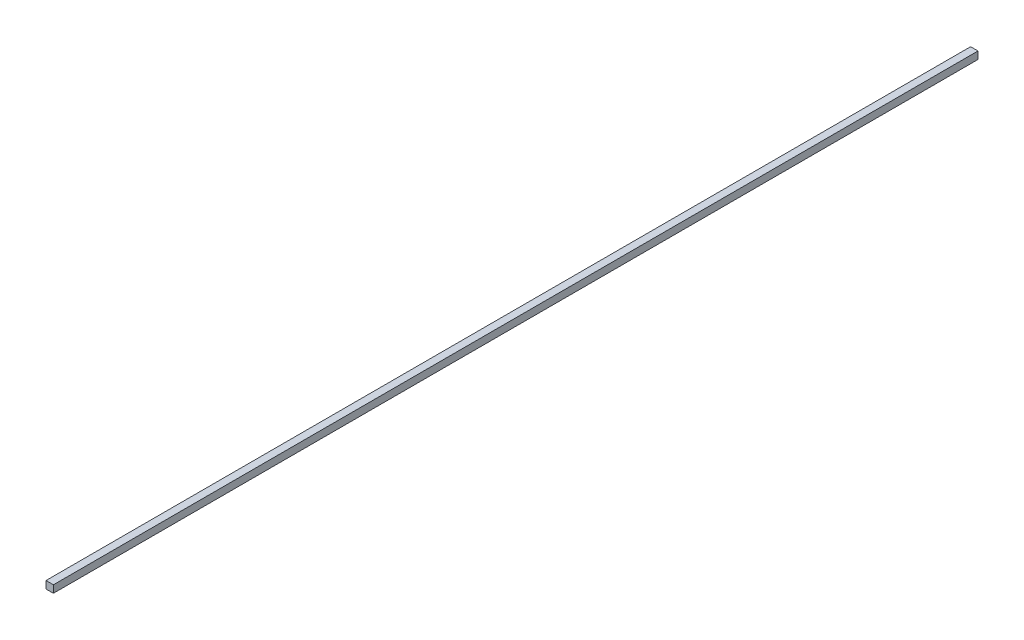
ISO-10303-21;
HEADER;
FILE_DESCRIPTION(('STEP AP214'),'2;1');
FILE_NAME('part.step','',(''),(''),'','','');
FILE_SCHEMA(('AUTOMOTIVE_DESIGN { 1 0 10303 214 1 1 1 1 }'));
ENDSEC;
DATA;
#1=APPLICATION_CONTEXT('core data for automotive mechanical design processes');
#2=APPLICATION_PROTOCOL_DEFINITION('international standard','automotive_design',2000,#1);
#3=PRODUCT_CONTEXT('',#1,'mechanical');
#4=PRODUCT('Part','Part','',(#3));
#5=PRODUCT_RELATED_PRODUCT_CATEGORY('part','',(#4));
#6=PRODUCT_DEFINITION_FORMATION('','',#4);
#7=PRODUCT_DEFINITION_CONTEXT('part definition',#1,'design');
#8=PRODUCT_DEFINITION('design','',#6,#7);
#9=PRODUCT_DEFINITION_SHAPE('','',#8);
#10=(LENGTH_UNIT() NAMED_UNIT(*) SI_UNIT(.MILLI.,.METRE.));
#11=(NAMED_UNIT(*) PLANE_ANGLE_UNIT() SI_UNIT($,.RADIAN.));
#12=(NAMED_UNIT(*) SI_UNIT($,.STERADIAN.) SOLID_ANGLE_UNIT());
#13=UNCERTAINTY_MEASURE_WITH_UNIT(LENGTH_MEASURE(1.E-05),#10,'distance_accuracy_value','');
#14=(GEOMETRIC_REPRESENTATION_CONTEXT(3) GLOBAL_UNCERTAINTY_ASSIGNED_CONTEXT((#13)) GLOBAL_UNIT_ASSIGNED_CONTEXT((#10,
#11,#12)) REPRESENTATION_CONTEXT('',''));
#15=CARTESIAN_POINT('',(0.,0.,0.));
#16=DIRECTION('',(0.,0.,1.));
#17=DIRECTION('',(1.,0.,0.));
#18=AXIS2_PLACEMENT_3D('',#15,#16,#17);
#19=CARTESIAN_POINT('',(0.,0.,2500.));
#20=DIRECTION('',(1.,0.,0.));
#21=DIRECTION('',(0.,0.,-1.));
#22=AXIS2_PLACEMENT_3D('',#19,#20,#21);
#23=PLANE('',#22);
#24=DIRECTION('',(0.,-1.,0.));
#25=VECTOR('',#24,1.);
#26=CARTESIAN_POINT('',(0.,0.,0.));
#27=LINE('',#26,#25);
#28=CARTESIAN_POINT('',(0.,20.,0.));
#29=VERTEX_POINT('',#28);
#30=CARTESIAN_POINT('',(0.,0.,0.));
#31=VERTEX_POINT('',#30);
#32=EDGE_CURVE('E96',#29,#31,#27,.T.);
#33=ORIENTED_EDGE('',*,*,#32,.T.);
#34=DIRECTION('',(0.,0.,-1.));
#35=VECTOR('',#34,1.);
#36=CARTESIAN_POINT('',(0.,0.,2500.));
#37=LINE('',#36,#35);
#38=CARTESIAN_POINT('',(0.,0.,2500.));
#39=VERTEX_POINT('',#38);
#40=EDGE_CURVE('E11',#39,#31,#37,.T.);
#41=ORIENTED_EDGE('',*,*,#40,.F.);
#42=DIRECTION('',(0.,-1.,0.));
#43=VECTOR('',#42,1.);
#44=CARTESIAN_POINT('',(0.,0.,2500.));
#45=LINE('',#44,#43);
#46=CARTESIAN_POINT('',(0.,20.,2500.));
#47=VERTEX_POINT('',#46);
#48=EDGE_CURVE('E84',#47,#39,#45,.T.);
#49=ORIENTED_EDGE('',*,*,#48,.F.);
#50=DIRECTION('',(0.,0.,-1.));
#51=VECTOR('',#50,1.);
#52=CARTESIAN_POINT('',(0.,20.,2500.));
#53=LINE('',#52,#51);
#54=EDGE_CURVE('E92',#47,#29,#53,.T.);
#55=ORIENTED_EDGE('',*,*,#54,.T.);
#56=EDGE_LOOP('',(#33,#41,#49,#55));
#57=FACE_BOUND('',#56,.T.);
#58=ADVANCED_FACE('F33',(#57),#23,.F.);
#59=CARTESIAN_POINT('',(0.,0.,2500.));
#60=DIRECTION('',(0.,1.,0.));
#61=DIRECTION('',(0.,0.,1.));
#62=AXIS2_PLACEMENT_3D('',#59,#60,#61);
#63=PLANE('',#62);
#64=DIRECTION('',(1.,0.,0.));
#65=VECTOR('',#64,1.);
#66=CARTESIAN_POINT('',(0.,0.,0.));
#67=LINE('',#66,#65);
#68=CARTESIAN_POINT('',(20.,0.,0.));
#69=VERTEX_POINT('',#68);
#70=EDGE_CURVE('E88',#31,#69,#67,.T.);
#71=ORIENTED_EDGE('',*,*,#70,.T.);
#72=DIRECTION('',(0.,0.,-1.));
#73=VECTOR('',#72,1.);
#74=CARTESIAN_POINT('',(20.,0.,2500.));
#75=LINE('',#74,#73);
#76=CARTESIAN_POINT('',(20.,0.,2500.));
#77=VERTEX_POINT('',#76);
#78=EDGE_CURVE('E41',#77,#69,#75,.T.);
#79=ORIENTED_EDGE('',*,*,#78,.F.);
#80=DIRECTION('',(1.,0.,0.));
#81=VECTOR('',#80,1.);
#82=CARTESIAN_POINT('',(0.,0.,2500.));
#83=LINE('',#82,#81);
#84=EDGE_CURVE('E79',#39,#77,#83,.T.);
#85=ORIENTED_EDGE('',*,*,#84,.F.);
#86=ORIENTED_EDGE('',*,*,#40,.T.);
#87=EDGE_LOOP('',(#71,#79,#85,#86));
#88=FACE_BOUND('',#87,.T.);
#89=ADVANCED_FACE('F87',(#88),#63,.F.);
#90=CARTESIAN_POINT('',(20.,0.,2500.));
#91=DIRECTION('',(-1.,0.,0.));
#92=DIRECTION('',(0.,0.,1.));
#93=AXIS2_PLACEMENT_3D('',#90,#91,#92);
#94=PLANE('',#93);
#95=DIRECTION('',(0.,1.,0.));
#96=VECTOR('',#95,1.);
#97=CARTESIAN_POINT('',(20.,0.,0.));
#98=LINE('',#97,#96);
#99=CARTESIAN_POINT('',(20.,20.,0.));
#100=VERTEX_POINT('',#99);
#101=EDGE_CURVE('E66',#69,#100,#98,.T.);
#102=ORIENTED_EDGE('',*,*,#101,.T.);
#103=DIRECTION('',(0.,0.,-1.));
#104=VECTOR('',#103,1.);
#105=CARTESIAN_POINT('',(20.,20.,2500.));
#106=LINE('',#105,#104);
#107=CARTESIAN_POINT('',(20.,20.,2500.));
#108=VERTEX_POINT('',#107);
#109=EDGE_CURVE('E89',#108,#100,#106,.T.);
#110=ORIENTED_EDGE('',*,*,#109,.F.);
#111=DIRECTION('',(0.,1.,0.));
#112=VECTOR('',#111,1.);
#113=CARTESIAN_POINT('',(20.,0.,2500.));
#114=LINE('',#113,#112);
#115=EDGE_CURVE('E82',#77,#108,#114,.T.);
#116=ORIENTED_EDGE('',*,*,#115,.F.);
#117=ORIENTED_EDGE('',*,*,#78,.T.);
#118=EDGE_LOOP('',(#102,#110,#116,#117));
#119=FACE_BOUND('',#118,.T.);
#120=ADVANCED_FACE('F90',(#119),#94,.F.);
#121=CARTESIAN_POINT('',(0.,20.,2500.));
#122=DIRECTION('',(0.,-1.,0.));
#123=DIRECTION('',(0.,0.,-1.));
#124=AXIS2_PLACEMENT_3D('',#121,#122,#123);
#125=PLANE('',#124);
#126=DIRECTION('',(-1.,0.,0.));
#127=VECTOR('',#126,1.);
#128=CARTESIAN_POINT('',(0.,20.,0.));
#129=LINE('',#128,#127);
#130=EDGE_CURVE('E72',#100,#29,#129,.T.);
#131=ORIENTED_EDGE('',*,*,#130,.T.);
#132=ORIENTED_EDGE('',*,*,#54,.F.);
#133=DIRECTION('',(-1.,0.,0.));
#134=VECTOR('',#133,1.);
#135=CARTESIAN_POINT('',(0.,20.,2500.));
#136=LINE('',#135,#134);
#137=EDGE_CURVE('E49',#108,#47,#136,.T.);
#138=ORIENTED_EDGE('',*,*,#137,.F.);
#139=ORIENTED_EDGE('',*,*,#109,.T.);
#140=EDGE_LOOP('',(#131,#132,#138,#139));
#141=FACE_BOUND('',#140,.T.);
#142=ADVANCED_FACE('F103',(#141),#125,.F.);
#143=CARTESIAN_POINT('',(0.,0.,2500.));
#144=DIRECTION('',(0.,0.,-1.));
#145=DIRECTION('',(-1.,0.,0.));
#146=AXIS2_PLACEMENT_3D('',#143,#144,#145);
#147=PLANE('',#146);
#148=ORIENTED_EDGE('',*,*,#48,.T.);
#149=ORIENTED_EDGE('',*,*,#84,.T.);
#150=ORIENTED_EDGE('',*,*,#115,.T.);
#151=ORIENTED_EDGE('',*,*,#137,.T.);
#152=EDGE_LOOP('',(#148,#149,#150,#151));
#153=FACE_BOUND('',#152,.T.);
#154=ADVANCED_FACE('F80',(#153),#147,.F.);
#155=CARTESIAN_POINT('',(0.,0.,0.));
#156=DIRECTION('',(0.,0.,-1.));
#157=DIRECTION('',(-1.,0.,0.));
#158=AXIS2_PLACEMENT_3D('',#155,#156,#157);
#159=PLANE('',#158);
#160=ORIENTED_EDGE('',*,*,#32,.F.);
#161=ORIENTED_EDGE('',*,*,#130,.F.);
#162=ORIENTED_EDGE('',*,*,#101,.F.);
#163=ORIENTED_EDGE('',*,*,#70,.F.);
#164=EDGE_LOOP('',(#160,#161,#162,#163));
#165=FACE_BOUND('',#164,.T.);
#166=ADVANCED_FACE('F106',(#165),#159,.T.);
#167=CLOSED_SHELL('',(#58,#89,#120,#142,#154,#166));
#168=MANIFOLD_SOLID_BREP('B2',#167);
#169=ADVANCED_BREP_SHAPE_REPRESENTATION('',(#18,#168),#14);
#170=SHAPE_DEFINITION_REPRESENTATION(#9,#169);
ENDSEC;
END-ISO-10303-21;
